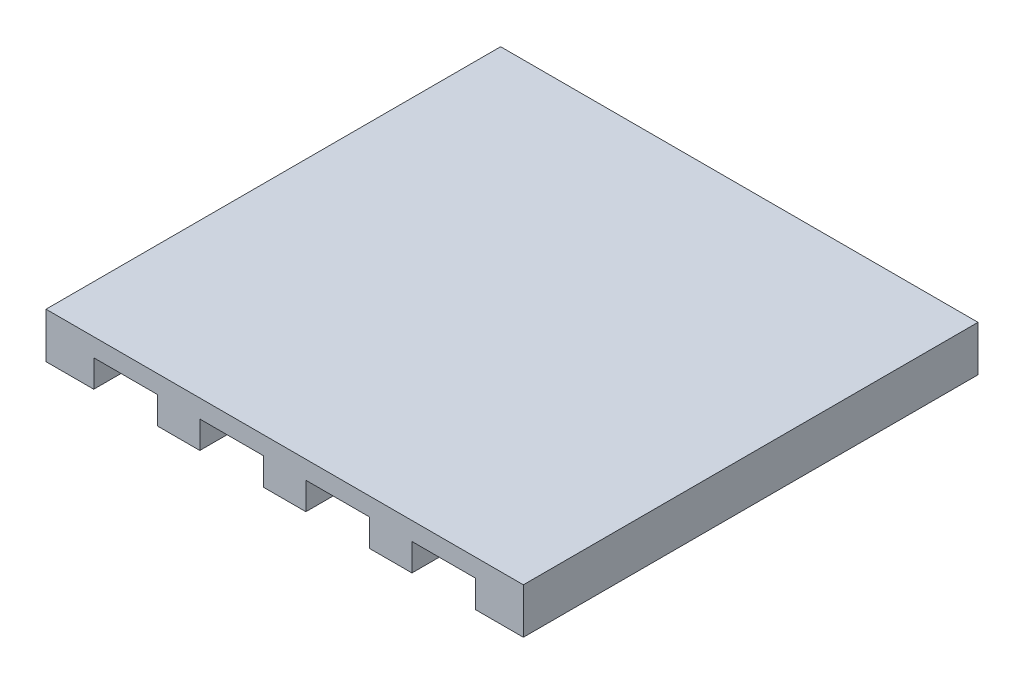
ISO-10303-21;
HEADER;
FILE_DESCRIPTION(('STEP AP214'),'2;1');
FILE_NAME('part.step','',(''),(''),'','','');
FILE_SCHEMA(('AUTOMOTIVE_DESIGN { 1 0 10303 214 1 1 1 1 }'));
ENDSEC;
DATA;
#1=APPLICATION_CONTEXT('core data for automotive mechanical design processes');
#2=APPLICATION_PROTOCOL_DEFINITION('international standard','automotive_design',2000,#1);
#3=PRODUCT_CONTEXT('',#1,'mechanical');
#4=PRODUCT('Part','Part','',(#3));
#5=PRODUCT_RELATED_PRODUCT_CATEGORY('part','',(#4));
#6=PRODUCT_DEFINITION_FORMATION('','',#4);
#7=PRODUCT_DEFINITION_CONTEXT('part definition',#1,'design');
#8=PRODUCT_DEFINITION('design','',#6,#7);
#9=PRODUCT_DEFINITION_SHAPE('','',#8);
#10=(LENGTH_UNIT() NAMED_UNIT(*) SI_UNIT(.MILLI.,.METRE.));
#11=(NAMED_UNIT(*) PLANE_ANGLE_UNIT() SI_UNIT($,.RADIAN.));
#12=(NAMED_UNIT(*) SI_UNIT($,.STERADIAN.) SOLID_ANGLE_UNIT());
#13=UNCERTAINTY_MEASURE_WITH_UNIT(LENGTH_MEASURE(1.E-05),#10,'distance_accuracy_value','');
#14=(GEOMETRIC_REPRESENTATION_CONTEXT(3) GLOBAL_UNCERTAINTY_ASSIGNED_CONTEXT((#13)) GLOBAL_UNIT_ASSIGNED_CONTEXT((#10,
#11,#12)) REPRESENTATION_CONTEXT('',''));
#15=CARTESIAN_POINT('',(0.,0.,0.));
#16=DIRECTION('',(0.,0.,1.));
#17=DIRECTION('',(1.,0.,0.));
#18=AXIS2_PLACEMENT_3D('',#15,#16,#17);
#19=CARTESIAN_POINT('',(52.5,10.,50.));
#20=DIRECTION('',(-1.,0.,0.));
#21=DIRECTION('',(0.,0.,1.));
#22=AXIS2_PLACEMENT_3D('',#19,#20,#21);
#23=PLANE('',#22);
#24=DIRECTION('',(0.,0.,-1.));
#25=VECTOR('',#24,1.);
#26=CARTESIAN_POINT('',(52.5,0.,50.));
#27=LINE('',#26,#25);
#28=CARTESIAN_POINT('',(52.5,0.,50.));
#29=VERTEX_POINT('',#28);
#30=CARTESIAN_POINT('',(52.5,0.,-50.));
#31=VERTEX_POINT('',#30);
#32=EDGE_CURVE('E347',#29,#31,#27,.T.);
#33=ORIENTED_EDGE('',*,*,#32,.T.);
#34=DIRECTION('',(0.,-1.,0.));
#35=VECTOR('',#34,1.);
#36=CARTESIAN_POINT('',(52.5,10.,-50.));
#37=LINE('',#36,#35);
#38=CARTESIAN_POINT('',(52.5,10.,-50.));
#39=VERTEX_POINT('',#38);
#40=EDGE_CURVE('E11',#39,#31,#37,.T.);
#41=ORIENTED_EDGE('',*,*,#40,.F.);
#42=DIRECTION('',(0.,0.,-1.));
#43=VECTOR('',#42,1.);
#44=CARTESIAN_POINT('',(52.5,10.,50.));
#45=LINE('',#44,#43);
#46=CARTESIAN_POINT('',(52.5,10.,50.));
#47=VERTEX_POINT('',#46);
#48=EDGE_CURVE('E332',#47,#39,#45,.T.);
#49=ORIENTED_EDGE('',*,*,#48,.F.);
#50=DIRECTION('',(0.,-1.,0.));
#51=VECTOR('',#50,1.);
#52=CARTESIAN_POINT('',(52.5,10.,50.));
#53=LINE('',#52,#51);
#54=EDGE_CURVE('E346',#47,#29,#53,.T.);
#55=ORIENTED_EDGE('',*,*,#54,.T.);
#56=EDGE_LOOP('',(#33,#41,#49,#55));
#57=FACE_BOUND('',#56,.T.);
#58=ADVANCED_FACE('F45',(#57),#23,.F.);
#59=CARTESIAN_POINT('',(-52.5,10.,-50.));
#60=DIRECTION('',(0.,0.,1.));
#61=DIRECTION('',(1.,0.,0.));
#62=AXIS2_PLACEMENT_3D('',#59,#60,#61);
#63=PLANE('',#62);
#64=DIRECTION('',(-1.,0.,0.));
#65=VECTOR('',#64,1.);
#66=CARTESIAN_POINT('',(-52.5,0.,-50.));
#67=LINE('',#66,#65);
#68=CARTESIAN_POINT('',(-52.5,0.,-50.));
#69=VERTEX_POINT('',#68);
#70=EDGE_CURVE('E351',#31,#69,#67,.T.);
#71=ORIENTED_EDGE('',*,*,#70,.T.);
#72=DIRECTION('',(0.,-1.,0.));
#73=VECTOR('',#72,1.);
#74=CARTESIAN_POINT('',(-52.5,10.,-50.));
#75=LINE('',#74,#73);
#76=CARTESIAN_POINT('',(-52.5,10.,-50.));
#77=VERTEX_POINT('',#76);
#78=EDGE_CURVE('E53',#77,#69,#75,.T.);
#79=ORIENTED_EDGE('',*,*,#78,.F.);
#80=DIRECTION('',(-1.,0.,0.));
#81=VECTOR('',#80,1.);
#82=CARTESIAN_POINT('',(-52.5,10.,-50.));
#83=LINE('',#82,#81);
#84=EDGE_CURVE('E336',#39,#77,#83,.T.);
#85=ORIENTED_EDGE('',*,*,#84,.F.);
#86=ORIENTED_EDGE('',*,*,#40,.T.);
#87=EDGE_LOOP('',(#71,#79,#85,#86));
#88=FACE_BOUND('',#87,.T.);
#89=ADVANCED_FACE('F388',(#88),#63,.F.);
#90=CARTESIAN_POINT('',(-52.5,10.,50.));
#91=DIRECTION('',(1.,0.,0.));
#92=DIRECTION('',(0.,0.,-1.));
#93=AXIS2_PLACEMENT_3D('',#90,#91,#92);
#94=PLANE('',#93);
#95=DIRECTION('',(0.,0.,1.));
#96=VECTOR('',#95,1.);
#97=CARTESIAN_POINT('',(-52.5,0.,50.));
#98=LINE('',#97,#96);
#99=CARTESIAN_POINT('',(-52.5,0.,50.));
#100=VERTEX_POINT('',#99);
#101=EDGE_CURVE('E354',#69,#100,#98,.T.);
#102=ORIENTED_EDGE('',*,*,#101,.T.);
#103=DIRECTION('',(0.,-1.,0.));
#104=VECTOR('',#103,1.);
#105=CARTESIAN_POINT('',(-52.5,10.,50.));
#106=LINE('',#105,#104);
#107=CARTESIAN_POINT('',(-52.5,10.,50.));
#108=VERTEX_POINT('',#107);
#109=EDGE_CURVE('E364',#108,#100,#106,.T.);
#110=ORIENTED_EDGE('',*,*,#109,.F.);
#111=DIRECTION('',(0.,0.,1.));
#112=VECTOR('',#111,1.);
#113=CARTESIAN_POINT('',(-52.5,10.,50.));
#114=LINE('',#113,#112);
#115=EDGE_CURVE('E340',#77,#108,#114,.T.);
#116=ORIENTED_EDGE('',*,*,#115,.F.);
#117=ORIENTED_EDGE('',*,*,#78,.T.);
#118=EDGE_LOOP('',(#102,#110,#116,#117));
#119=FACE_BOUND('',#118,.T.);
#120=ADVANCED_FACE('F373',(#119),#94,.F.);
#121=CARTESIAN_POINT('',(-52.5,10.,50.));
#122=DIRECTION('',(0.,0.,-1.));
#123=DIRECTION('',(-1.,0.,0.));
#124=AXIS2_PLACEMENT_3D('',#121,#122,#123);
#125=PLANE('',#124);
#126=DIRECTION('',(1.,0.,0.));
#127=VECTOR('',#126,1.);
#128=CARTESIAN_POINT('',(-52.5,0.,50.));
#129=LINE('',#128,#127);
#130=CARTESIAN_POINT('',(-41.995,0.,50.));
#131=VERTEX_POINT('',#130);
#132=EDGE_CURVE('E337',#100,#131,#129,.T.);
#133=ORIENTED_EDGE('',*,*,#132,.T.);
#134=DIRECTION('',(0.,-1.,0.));
#135=VECTOR('',#134,1.);
#136=CARTESIAN_POINT('',(-41.995,0.,50.));
#137=LINE('',#136,#135);
#138=CARTESIAN_POINT('',(-41.995,6.,50.));
#139=VERTEX_POINT('',#138);
#140=EDGE_CURVE('E281',#139,#131,#137,.T.);
#141=ORIENTED_EDGE('',*,*,#140,.F.);
#142=DIRECTION('',(-1.,0.,0.));
#143=VECTOR('',#142,1.);
#144=CARTESIAN_POINT('',(-41.995,6.,50.));
#145=LINE('',#144,#143);
#146=CARTESIAN_POINT('',(-27.995,6.,50.));
#147=VERTEX_POINT('',#146);
#148=EDGE_CURVE('E412',#147,#139,#145,.T.);
#149=ORIENTED_EDGE('',*,*,#148,.F.);
#150=DIRECTION('',(0.,1.,0.));
#151=VECTOR('',#150,1.);
#152=CARTESIAN_POINT('',(-27.995,0.,50.));
#153=LINE('',#152,#151);
#154=CARTESIAN_POINT('',(-27.995,0.,50.));
#155=VERTEX_POINT('',#154);
#156=EDGE_CURVE('E410',#155,#147,#153,.T.);
#157=ORIENTED_EDGE('',*,*,#156,.F.);
#158=CARTESIAN_POINT('',(-18.665,0.,50.));
#159=VERTEX_POINT('',#158);
#160=EDGE_CURVE('E207',#155,#159,#129,.T.);
#161=ORIENTED_EDGE('',*,*,#160,.T.);
#162=DIRECTION('',(0.,-1.,0.));
#163=VECTOR('',#162,1.);
#164=CARTESIAN_POINT('',(-18.665,0.,50.));
#165=LINE('',#164,#163);
#166=CARTESIAN_POINT('',(-18.665,6.,50.));
#167=VERTEX_POINT('',#166);
#168=EDGE_CURVE('E278',#167,#159,#165,.T.);
#169=ORIENTED_EDGE('',*,*,#168,.F.);
#170=DIRECTION('',(-1.,0.,0.));
#171=VECTOR('',#170,1.);
#172=CARTESIAN_POINT('',(-18.665,6.,50.));
#173=LINE('',#172,#171);
#174=CARTESIAN_POINT('',(-4.665,6.,50.));
#175=VERTEX_POINT('',#174);
#176=EDGE_CURVE('E269',#175,#167,#173,.T.);
#177=ORIENTED_EDGE('',*,*,#176,.F.);
#178=DIRECTION('',(0.,1.,0.));
#179=VECTOR('',#178,1.);
#180=CARTESIAN_POINT('',(-4.665,0.,50.));
#181=LINE('',#180,#179);
#182=CARTESIAN_POINT('',(-4.665,0.,50.));
#183=VERTEX_POINT('',#182);
#184=EDGE_CURVE('E273',#183,#175,#181,.T.);
#185=ORIENTED_EDGE('',*,*,#184,.F.);
#186=CARTESIAN_POINT('',(4.665,0.,50.));
#187=VERTEX_POINT('',#186);
#188=EDGE_CURVE('E398',#183,#187,#129,.T.);
#189=ORIENTED_EDGE('',*,*,#188,.T.);
#190=DIRECTION('',(0.,-1.,0.));
#191=VECTOR('',#190,1.);
#192=CARTESIAN_POINT('',(4.665,0.,50.));
#193=LINE('',#192,#191);
#194=CARTESIAN_POINT('',(4.665,6.,50.));
#195=VERTEX_POINT('',#194);
#196=EDGE_CURVE('E240',#195,#187,#193,.T.);
#197=ORIENTED_EDGE('',*,*,#196,.F.);
#198=DIRECTION('',(-1.,0.,0.));
#199=VECTOR('',#198,1.);
#200=CARTESIAN_POINT('',(4.665,6.,50.));
#201=LINE('',#200,#199);
#202=CARTESIAN_POINT('',(18.665,6.,50.));
#203=VERTEX_POINT('',#202);
#204=EDGE_CURVE('E232',#203,#195,#201,.T.);
#205=ORIENTED_EDGE('',*,*,#204,.F.);
#206=DIRECTION('',(0.,1.,0.));
#207=VECTOR('',#206,1.);
#208=CARTESIAN_POINT('',(18.665,0.,50.));
#209=LINE('',#208,#207);
#210=CARTESIAN_POINT('',(18.665,0.,50.));
#211=VERTEX_POINT('',#210);
#212=EDGE_CURVE('E236',#211,#203,#209,.T.);
#213=ORIENTED_EDGE('',*,*,#212,.F.);
#214=CARTESIAN_POINT('',(27.995,0.,50.));
#215=VERTEX_POINT('',#214);
#216=EDGE_CURVE('E395',#211,#215,#129,.T.);
#217=ORIENTED_EDGE('',*,*,#216,.T.);
#218=DIRECTION('',(0.,-1.,0.));
#219=VECTOR('',#218,1.);
#220=CARTESIAN_POINT('',(27.995,0.,50.));
#221=LINE('',#220,#219);
#222=CARTESIAN_POINT('',(27.995,6.,50.));
#223=VERTEX_POINT('',#222);
#224=EDGE_CURVE('E268',#223,#215,#221,.T.);
#225=ORIENTED_EDGE('',*,*,#224,.F.);
#226=DIRECTION('',(-1.,0.,0.));
#227=VECTOR('',#226,1.);
#228=CARTESIAN_POINT('',(27.995,6.,50.));
#229=LINE('',#228,#227);
#230=CARTESIAN_POINT('',(41.995,6.,50.));
#231=VERTEX_POINT('',#230);
#232=EDGE_CURVE('E308',#231,#223,#229,.T.);
#233=ORIENTED_EDGE('',*,*,#232,.F.);
#234=DIRECTION('',(0.,1.,0.));
#235=VECTOR('',#234,1.);
#236=CARTESIAN_POINT('',(41.995,0.,50.));
#237=LINE('',#236,#235);
#238=CARTESIAN_POINT('',(41.995,0.,50.));
#239=VERTEX_POINT('',#238);
#240=EDGE_CURVE('E312',#239,#231,#237,.T.);
#241=ORIENTED_EDGE('',*,*,#240,.F.);
#242=EDGE_CURVE('E357',#239,#29,#129,.T.);
#243=ORIENTED_EDGE('',*,*,#242,.T.);
#244=ORIENTED_EDGE('',*,*,#54,.F.);
#245=DIRECTION('',(1.,0.,0.));
#246=VECTOR('',#245,1.);
#247=CARTESIAN_POINT('',(-52.5,10.,50.));
#248=LINE('',#247,#246);
#249=EDGE_CURVE('E343',#108,#47,#248,.T.);
#250=ORIENTED_EDGE('',*,*,#249,.F.);
#251=ORIENTED_EDGE('',*,*,#109,.T.);
#252=EDGE_LOOP('',(#133,#141,#149,#157,#161,#169,#177,#185,#189,#197,#205,#213,#217,#225,#233,
#241,#243,#244,#250,#251));
#253=FACE_BOUND('',#252,.T.);
#254=ADVANCED_FACE('F380',(#253),#125,.F.);
#255=CARTESIAN_POINT('',(0.,10.,0.));
#256=DIRECTION('',(0.,-1.,0.));
#257=DIRECTION('',(0.,0.,-1.));
#258=AXIS2_PLACEMENT_3D('',#255,#256,#257);
#259=PLANE('',#258);
#260=ORIENTED_EDGE('',*,*,#48,.T.);
#261=ORIENTED_EDGE('',*,*,#84,.T.);
#262=ORIENTED_EDGE('',*,*,#115,.T.);
#263=ORIENTED_EDGE('',*,*,#249,.T.);
#264=EDGE_LOOP('',(#260,#261,#262,#263));
#265=FACE_BOUND('',#264,.T.);
#266=ADVANCED_FACE('F386',(#265),#259,.F.);
#267=CARTESIAN_POINT('',(0.,0.,0.));
#268=DIRECTION('',(0.,-1.,0.));
#269=DIRECTION('',(0.,0.,-1.));
#270=AXIS2_PLACEMENT_3D('',#267,#268,#269);
#271=PLANE('',#270);
#272=DIRECTION('',(0.,0.,1.));
#273=VECTOR('',#272,1.);
#274=CARTESIAN_POINT('',(-41.995,0.,15.));
#275=LINE('',#274,#273);
#276=CARTESIAN_POINT('',(-41.995,0.,15.));
#277=VERTEX_POINT('',#276);
#278=EDGE_CURVE('E209',#277,#131,#275,.T.);
#279=ORIENTED_EDGE('',*,*,#278,.T.);
#280=ORIENTED_EDGE('',*,*,#132,.F.);
#281=ORIENTED_EDGE('',*,*,#101,.F.);
#282=ORIENTED_EDGE('',*,*,#70,.F.);
#283=ORIENTED_EDGE('',*,*,#32,.F.);
#284=ORIENTED_EDGE('',*,*,#242,.F.);
#285=DIRECTION('',(0.,0.,1.));
#286=VECTOR('',#285,1.);
#287=CARTESIAN_POINT('',(41.995,0.,15.));
#288=LINE('',#287,#286);
#289=CARTESIAN_POINT('',(41.995,0.,15.));
#290=VERTEX_POINT('',#289);
#291=EDGE_CURVE('E300',#290,#239,#288,.T.);
#292=ORIENTED_EDGE('',*,*,#291,.F.);
#293=DIRECTION('',(1.,0.,0.));
#294=VECTOR('',#293,1.);
#295=CARTESIAN_POINT('',(27.995,0.,15.));
#296=LINE('',#295,#294);
#297=CARTESIAN_POINT('',(27.995,0.,15.));
#298=VERTEX_POINT('',#297);
#299=EDGE_CURVE('E326',#298,#290,#296,.T.);
#300=ORIENTED_EDGE('',*,*,#299,.F.);
#301=DIRECTION('',(0.,0.,1.));
#302=VECTOR('',#301,1.);
#303=CARTESIAN_POINT('',(27.995,0.,15.));
#304=LINE('',#303,#302);
#305=EDGE_CURVE('E295',#298,#215,#304,.T.);
#306=ORIENTED_EDGE('',*,*,#305,.T.);
#307=ORIENTED_EDGE('',*,*,#216,.F.);
#308=DIRECTION('',(0.,0.,1.));
#309=VECTOR('',#308,1.);
#310=CARTESIAN_POINT('',(18.665,0.,15.));
#311=LINE('',#310,#309);
#312=CARTESIAN_POINT('',(18.665,0.,15.));
#313=VERTEX_POINT('',#312);
#314=EDGE_CURVE('E223',#313,#211,#311,.T.);
#315=ORIENTED_EDGE('',*,*,#314,.F.);
#316=DIRECTION('',(1.,0.,0.));
#317=VECTOR('',#316,1.);
#318=CARTESIAN_POINT('',(4.665,0.,15.));
#319=LINE('',#318,#317);
#320=CARTESIAN_POINT('',(4.665,0.,15.));
#321=VERTEX_POINT('',#320);
#322=EDGE_CURVE('E250',#321,#313,#319,.T.);
#323=ORIENTED_EDGE('',*,*,#322,.F.);
#324=DIRECTION('',(0.,0.,1.));
#325=VECTOR('',#324,1.);
#326=CARTESIAN_POINT('',(4.665,0.,15.));
#327=LINE('',#326,#325);
#328=EDGE_CURVE('E218',#321,#187,#327,.T.);
#329=ORIENTED_EDGE('',*,*,#328,.T.);
#330=ORIENTED_EDGE('',*,*,#188,.F.);
#331=DIRECTION('',(0.,0.,1.));
#332=VECTOR('',#331,1.);
#333=CARTESIAN_POINT('',(-4.665,0.,15.));
#334=LINE('',#333,#332);
#335=CARTESIAN_POINT('',(-4.665,0.,15.));
#336=VERTEX_POINT('',#335);
#337=EDGE_CURVE('E259',#336,#183,#334,.T.);
#338=ORIENTED_EDGE('',*,*,#337,.F.);
#339=DIRECTION('',(1.,0.,0.));
#340=VECTOR('',#339,1.);
#341=CARTESIAN_POINT('',(-18.665,0.,15.));
#342=LINE('',#341,#340);
#343=CARTESIAN_POINT('',(-18.665,0.,15.));
#344=VERTEX_POINT('',#343);
#345=EDGE_CURVE('E289',#344,#336,#342,.T.);
#346=ORIENTED_EDGE('',*,*,#345,.F.);
#347=DIRECTION('',(0.,0.,1.));
#348=VECTOR('',#347,1.);
#349=CARTESIAN_POINT('',(-18.665,0.,15.));
#350=LINE('',#349,#348);
#351=EDGE_CURVE('E255',#344,#159,#350,.T.);
#352=ORIENTED_EDGE('',*,*,#351,.T.);
#353=ORIENTED_EDGE('',*,*,#160,.F.);
#354=DIRECTION('',(0.,0.,1.));
#355=VECTOR('',#354,1.);
#356=CARTESIAN_POINT('',(-27.995,0.,15.));
#357=LINE('',#356,#355);
#358=CARTESIAN_POINT('',(-27.995,0.,15.));
#359=VERTEX_POINT('',#358);
#360=EDGE_CURVE('E189',#359,#155,#357,.T.);
#361=ORIENTED_EDGE('',*,*,#360,.F.);
#362=DIRECTION('',(1.,0.,0.));
#363=VECTOR('',#362,1.);
#364=CARTESIAN_POINT('',(-41.995,0.,15.));
#365=LINE('',#364,#363);
#366=EDGE_CURVE('E195',#277,#359,#365,.T.);
#367=ORIENTED_EDGE('',*,*,#366,.F.);
#368=EDGE_LOOP('',(#279,#280,#281,#282,#283,#284,#292,#300,#306,#307,#315,#323,#329,#330,#338,
#346,#352,#353,#361,#367));
#369=FACE_BOUND('',#368,.T.);
#370=ADVANCED_FACE('F204',(#369),#271,.T.);
#371=CARTESIAN_POINT('',(-18.665,0.,15.));
#372=DIRECTION('',(-1.,0.,0.));
#373=DIRECTION('',(0.,0.,1.));
#374=AXIS2_PLACEMENT_3D('',#371,#372,#373);
#375=PLANE('',#374);
#376=ORIENTED_EDGE('',*,*,#168,.T.);
#377=ORIENTED_EDGE('',*,*,#351,.F.);
#378=DIRECTION('',(0.,-1.,0.));
#379=VECTOR('',#378,1.);
#380=CARTESIAN_POINT('',(-18.665,0.,15.));
#381=LINE('',#380,#379);
#382=CARTESIAN_POINT('',(-18.665,6.,15.));
#383=VERTEX_POINT('',#382);
#384=EDGE_CURVE('E274',#383,#344,#381,.T.);
#385=ORIENTED_EDGE('',*,*,#384,.F.);
#386=DIRECTION('',(0.,0.,1.));
#387=VECTOR('',#386,1.);
#388=CARTESIAN_POINT('',(-18.665,6.,15.));
#389=LINE('',#388,#387);
#390=EDGE_CURVE('E265',#383,#167,#389,.T.);
#391=ORIENTED_EDGE('',*,*,#390,.T.);
#392=EDGE_LOOP('',(#376,#377,#385,#391));
#393=FACE_BOUND('',#392,.T.);
#394=ADVANCED_FACE('F451',(#393),#375,.F.);
#395=CARTESIAN_POINT('',(-18.665,6.,15.));
#396=DIRECTION('',(0.,1.,0.));
#397=DIRECTION('',(0.,0.,1.));
#398=AXIS2_PLACEMENT_3D('',#395,#396,#397);
#399=PLANE('',#398);
#400=ORIENTED_EDGE('',*,*,#176,.T.);
#401=ORIENTED_EDGE('',*,*,#390,.F.);
#402=DIRECTION('',(-1.,0.,0.));
#403=VECTOR('',#402,1.);
#404=CARTESIAN_POINT('',(-18.665,6.,15.));
#405=LINE('',#404,#403);
#406=CARTESIAN_POINT('',(-4.665,6.,15.));
#407=VERTEX_POINT('',#406);
#408=EDGE_CURVE('E258',#407,#383,#405,.T.);
#409=ORIENTED_EDGE('',*,*,#408,.F.);
#410=DIRECTION('',(0.,0.,1.));
#411=VECTOR('',#410,1.);
#412=CARTESIAN_POINT('',(-4.665,6.,15.));
#413=LINE('',#412,#411);
#414=EDGE_CURVE('E262',#407,#175,#413,.T.);
#415=ORIENTED_EDGE('',*,*,#414,.T.);
#416=EDGE_LOOP('',(#400,#401,#409,#415));
#417=FACE_BOUND('',#416,.T.);
#418=ADVANCED_FACE('F476',(#417),#399,.F.);
#419=CARTESIAN_POINT('',(-4.665,0.,15.));
#420=DIRECTION('',(1.,0.,0.));
#421=DIRECTION('',(0.,0.,-1.));
#422=AXIS2_PLACEMENT_3D('',#419,#420,#421);
#423=PLANE('',#422);
#424=ORIENTED_EDGE('',*,*,#184,.T.);
#425=ORIENTED_EDGE('',*,*,#414,.F.);
#426=DIRECTION('',(0.,1.,0.));
#427=VECTOR('',#426,1.);
#428=CARTESIAN_POINT('',(-4.665,0.,15.));
#429=LINE('',#428,#427);
#430=EDGE_CURVE('E285',#336,#407,#429,.T.);
#431=ORIENTED_EDGE('',*,*,#430,.F.);
#432=ORIENTED_EDGE('',*,*,#337,.T.);
#433=EDGE_LOOP('',(#424,#425,#431,#432));
#434=FACE_BOUND('',#433,.T.);
#435=ADVANCED_FACE('F474',(#434),#423,.F.);
#436=CARTESIAN_POINT('',(0.,0.,15.));
#437=DIRECTION('',(0.,0.,-1.));
#438=DIRECTION('',(-1.,0.,0.));
#439=AXIS2_PLACEMENT_3D('',#436,#437,#438);
#440=PLANE('',#439);
#441=ORIENTED_EDGE('',*,*,#384,.T.);
#442=ORIENTED_EDGE('',*,*,#345,.T.);
#443=ORIENTED_EDGE('',*,*,#430,.T.);
#444=ORIENTED_EDGE('',*,*,#408,.T.);
#445=EDGE_LOOP('',(#441,#442,#443,#444));
#446=FACE_BOUND('',#445,.T.);
#447=ADVANCED_FACE('F470',(#446),#440,.F.);
#448=CARTESIAN_POINT('',(27.995,0.,15.));
#449=DIRECTION('',(-1.,0.,0.));
#450=DIRECTION('',(0.,0.,1.));
#451=AXIS2_PLACEMENT_3D('',#448,#449,#450);
#452=PLANE('',#451);
#453=ORIENTED_EDGE('',*,*,#224,.T.);
#454=ORIENTED_EDGE('',*,*,#305,.F.);
#455=DIRECTION('',(0.,-1.,0.));
#456=VECTOR('',#455,1.);
#457=CARTESIAN_POINT('',(27.995,0.,15.));
#458=LINE('',#457,#456);
#459=CARTESIAN_POINT('',(27.995,6.,15.));
#460=VERTEX_POINT('',#459);
#461=EDGE_CURVE('E313',#460,#298,#458,.T.);
#462=ORIENTED_EDGE('',*,*,#461,.F.);
#463=DIRECTION('',(0.,0.,1.));
#464=VECTOR('',#463,1.);
#465=CARTESIAN_POINT('',(27.995,6.,15.));
#466=LINE('',#465,#464);
#467=EDGE_CURVE('E243',#460,#223,#466,.T.);
#468=ORIENTED_EDGE('',*,*,#467,.T.);
#469=EDGE_LOOP('',(#453,#454,#462,#468));
#470=FACE_BOUND('',#469,.T.);
#471=ADVANCED_FACE('F463',(#470),#452,.F.);
#472=CARTESIAN_POINT('',(27.995,6.,15.));
#473=DIRECTION('',(0.,1.,0.));
#474=DIRECTION('',(0.,0.,1.));
#475=AXIS2_PLACEMENT_3D('',#472,#473,#474);
#476=PLANE('',#475);
#477=ORIENTED_EDGE('',*,*,#232,.T.);
#478=ORIENTED_EDGE('',*,*,#467,.F.);
#479=DIRECTION('',(-1.,0.,0.));
#480=VECTOR('',#479,1.);
#481=CARTESIAN_POINT('',(27.995,6.,15.));
#482=LINE('',#481,#480);
#483=CARTESIAN_POINT('',(41.995,6.,15.));
#484=VERTEX_POINT('',#483);
#485=EDGE_CURVE('E299',#484,#460,#482,.T.);
#486=ORIENTED_EDGE('',*,*,#485,.F.);
#487=DIRECTION('',(0.,0.,1.));
#488=VECTOR('',#487,1.);
#489=CARTESIAN_POINT('',(41.995,6.,15.));
#490=LINE('',#489,#488);
#491=EDGE_CURVE('E303',#484,#231,#490,.T.);
#492=ORIENTED_EDGE('',*,*,#491,.T.);
#493=EDGE_LOOP('',(#477,#478,#486,#492));
#494=FACE_BOUND('',#493,.T.);
#495=ADVANCED_FACE('F460',(#494),#476,.F.);
#496=CARTESIAN_POINT('',(41.995,0.,15.));
#497=DIRECTION('',(1.,0.,0.));
#498=DIRECTION('',(0.,0.,-1.));
#499=AXIS2_PLACEMENT_3D('',#496,#497,#498);
#500=PLANE('',#499);
#501=ORIENTED_EDGE('',*,*,#240,.T.);
#502=ORIENTED_EDGE('',*,*,#491,.F.);
#503=DIRECTION('',(0.,1.,0.));
#504=VECTOR('',#503,1.);
#505=CARTESIAN_POINT('',(41.995,0.,15.));
#506=LINE('',#505,#504);
#507=EDGE_CURVE('E322',#290,#484,#506,.T.);
#508=ORIENTED_EDGE('',*,*,#507,.F.);
#509=ORIENTED_EDGE('',*,*,#291,.T.);
#510=EDGE_LOOP('',(#501,#502,#508,#509));
#511=FACE_BOUND('',#510,.T.);
#512=ADVANCED_FACE('F458',(#511),#500,.F.);
#513=CARTESIAN_POINT('',(0.,0.,15.));
#514=DIRECTION('',(0.,0.,-1.));
#515=DIRECTION('',(-1.,0.,0.));
#516=AXIS2_PLACEMENT_3D('',#513,#514,#515);
#517=PLANE('',#516);
#518=ORIENTED_EDGE('',*,*,#461,.T.);
#519=ORIENTED_EDGE('',*,*,#299,.T.);
#520=ORIENTED_EDGE('',*,*,#507,.T.);
#521=ORIENTED_EDGE('',*,*,#485,.T.);
#522=EDGE_LOOP('',(#518,#519,#520,#521));
#523=FACE_BOUND('',#522,.T.);
#524=ADVANCED_FACE('F454',(#523),#517,.F.);
#525=CARTESIAN_POINT('',(4.665,0.,15.));
#526=DIRECTION('',(-1.,0.,0.));
#527=DIRECTION('',(0.,0.,1.));
#528=AXIS2_PLACEMENT_3D('',#525,#526,#527);
#529=PLANE('',#528);
#530=ORIENTED_EDGE('',*,*,#196,.T.);
#531=ORIENTED_EDGE('',*,*,#328,.F.);
#532=DIRECTION('',(0.,-1.,0.));
#533=VECTOR('',#532,1.);
#534=CARTESIAN_POINT('',(4.665,0.,15.));
#535=LINE('',#534,#533);
#536=CARTESIAN_POINT('',(4.665,6.,15.));
#537=VERTEX_POINT('',#536);
#538=EDGE_CURVE('E68',#537,#321,#535,.T.);
#539=ORIENTED_EDGE('',*,*,#538,.F.);
#540=DIRECTION('',(0.,0.,1.));
#541=VECTOR('',#540,1.);
#542=CARTESIAN_POINT('',(4.665,6.,15.));
#543=LINE('',#542,#541);
#544=EDGE_CURVE('E229',#537,#195,#543,.T.);
#545=ORIENTED_EDGE('',*,*,#544,.T.);
#546=EDGE_LOOP('',(#530,#531,#539,#545));
#547=FACE_BOUND('',#546,.T.);
#548=ADVANCED_FACE('F457',(#547),#529,.F.);
#549=CARTESIAN_POINT('',(4.665,6.,15.));
#550=DIRECTION('',(0.,1.,0.));
#551=DIRECTION('',(0.,0.,1.));
#552=AXIS2_PLACEMENT_3D('',#549,#550,#551);
#553=PLANE('',#552);
#554=ORIENTED_EDGE('',*,*,#204,.T.);
#555=ORIENTED_EDGE('',*,*,#544,.F.);
#556=DIRECTION('',(-1.,0.,0.));
#557=VECTOR('',#556,1.);
#558=CARTESIAN_POINT('',(4.665,6.,15.));
#559=LINE('',#558,#557);
#560=CARTESIAN_POINT('',(18.665,6.,15.));
#561=VERTEX_POINT('',#560);
#562=EDGE_CURVE('E222',#561,#537,#559,.T.);
#563=ORIENTED_EDGE('',*,*,#562,.F.);
#564=DIRECTION('',(0.,0.,1.));
#565=VECTOR('',#564,1.);
#566=CARTESIAN_POINT('',(18.665,6.,15.));
#567=LINE('',#566,#565);
#568=EDGE_CURVE('E226',#561,#203,#567,.T.);
#569=ORIENTED_EDGE('',*,*,#568,.T.);
#570=EDGE_LOOP('',(#554,#555,#563,#569));
#571=FACE_BOUND('',#570,.T.);
#572=ADVANCED_FACE('F489',(#571),#553,.F.);
#573=CARTESIAN_POINT('',(18.665,0.,15.));
#574=DIRECTION('',(1.,0.,0.));
#575=DIRECTION('',(0.,0.,-1.));
#576=AXIS2_PLACEMENT_3D('',#573,#574,#575);
#577=PLANE('',#576);
#578=ORIENTED_EDGE('',*,*,#212,.T.);
#579=ORIENTED_EDGE('',*,*,#568,.F.);
#580=DIRECTION('',(0.,1.,0.));
#581=VECTOR('',#580,1.);
#582=CARTESIAN_POINT('',(18.665,0.,15.));
#583=LINE('',#582,#581);
#584=EDGE_CURVE('E246',#313,#561,#583,.T.);
#585=ORIENTED_EDGE('',*,*,#584,.F.);
#586=ORIENTED_EDGE('',*,*,#314,.T.);
#587=EDGE_LOOP('',(#578,#579,#585,#586));
#588=FACE_BOUND('',#587,.T.);
#589=ADVANCED_FACE('F488',(#588),#577,.F.);
#590=CARTESIAN_POINT('',(0.,0.,15.));
#591=DIRECTION('',(0.,0.,-1.));
#592=DIRECTION('',(-1.,0.,0.));
#593=AXIS2_PLACEMENT_3D('',#590,#591,#592);
#594=PLANE('',#593);
#595=ORIENTED_EDGE('',*,*,#538,.T.);
#596=ORIENTED_EDGE('',*,*,#322,.T.);
#597=ORIENTED_EDGE('',*,*,#584,.T.);
#598=ORIENTED_EDGE('',*,*,#562,.T.);
#599=EDGE_LOOP('',(#595,#596,#597,#598));
#600=FACE_BOUND('',#599,.T.);
#601=ADVANCED_FACE('F435',(#600),#594,.F.);
#602=CARTESIAN_POINT('',(-41.995,0.,15.));
#603=DIRECTION('',(-1.,0.,0.));
#604=DIRECTION('',(0.,0.,1.));
#605=AXIS2_PLACEMENT_3D('',#602,#603,#604);
#606=PLANE('',#605);
#607=ORIENTED_EDGE('',*,*,#140,.T.);
#608=ORIENTED_EDGE('',*,*,#278,.F.);
#609=DIRECTION('',(0.,-1.,0.));
#610=VECTOR('',#609,1.);
#611=CARTESIAN_POINT('',(-41.995,0.,15.));
#612=LINE('',#611,#610);
#613=CARTESIAN_POINT('',(-41.995,6.,15.));
#614=VERTEX_POINT('',#613);
#615=EDGE_CURVE('E60',#614,#277,#612,.T.);
#616=ORIENTED_EDGE('',*,*,#615,.F.);
#617=DIRECTION('',(0.,0.,1.));
#618=VECTOR('',#617,1.);
#619=CARTESIAN_POINT('',(-41.995,6.,15.));
#620=LINE('',#619,#618);
#621=EDGE_CURVE('E213',#614,#139,#620,.T.);
#622=ORIENTED_EDGE('',*,*,#621,.T.);
#623=EDGE_LOOP('',(#607,#608,#616,#622));
#624=FACE_BOUND('',#623,.T.);
#625=ADVANCED_FACE('F422',(#624),#606,.F.);
#626=CARTESIAN_POINT('',(-41.995,6.,15.));
#627=DIRECTION('',(0.,1.,0.));
#628=DIRECTION('',(-1.,0.,0.));
#629=AXIS2_PLACEMENT_3D('',#626,#627,#628);
#630=PLANE('',#629);
#631=ORIENTED_EDGE('',*,*,#148,.T.);
#632=ORIENTED_EDGE('',*,*,#621,.F.);
#633=DIRECTION('',(-1.,0.,0.));
#634=VECTOR('',#633,1.);
#635=CARTESIAN_POINT('',(-41.995,6.,15.));
#636=LINE('',#635,#634);
#637=CARTESIAN_POINT('',(-27.995,6.,15.));
#638=VERTEX_POINT('',#637);
#639=EDGE_CURVE('E194',#638,#614,#636,.T.);
#640=ORIENTED_EDGE('',*,*,#639,.F.);
#641=DIRECTION('',(0.,0.,1.));
#642=VECTOR('',#641,1.);
#643=CARTESIAN_POINT('',(-27.995,6.,15.));
#644=LINE('',#643,#642);
#645=EDGE_CURVE('E191',#638,#147,#644,.T.);
#646=ORIENTED_EDGE('',*,*,#645,.T.);
#647=EDGE_LOOP('',(#631,#632,#640,#646));
#648=FACE_BOUND('',#647,.T.);
#649=ADVANCED_FACE('F424',(#648),#630,.F.);
#650=CARTESIAN_POINT('',(-27.995,0.,15.));
#651=DIRECTION('',(1.,0.,0.));
#652=DIRECTION('',(0.,0.,-1.));
#653=AXIS2_PLACEMENT_3D('',#650,#651,#652);
#654=PLANE('',#653);
#655=ORIENTED_EDGE('',*,*,#156,.T.);
#656=ORIENTED_EDGE('',*,*,#645,.F.);
#657=DIRECTION('',(0.,1.,0.));
#658=VECTOR('',#657,1.);
#659=CARTESIAN_POINT('',(-27.995,0.,15.));
#660=LINE('',#659,#658);
#661=EDGE_CURVE('E185',#359,#638,#660,.T.);
#662=ORIENTED_EDGE('',*,*,#661,.F.);
#663=ORIENTED_EDGE('',*,*,#360,.T.);
#664=EDGE_LOOP('',(#655,#656,#662,#663));
#665=FACE_BOUND('',#664,.T.);
#666=ADVANCED_FACE('F187',(#665),#654,.F.);
#667=CARTESIAN_POINT('',(0.,0.,15.));
#668=DIRECTION('',(0.,0.,-1.));
#669=DIRECTION('',(-1.,0.,0.));
#670=AXIS2_PLACEMENT_3D('',#667,#668,#669);
#671=PLANE('',#670);
#672=ORIENTED_EDGE('',*,*,#615,.T.);
#673=ORIENTED_EDGE('',*,*,#366,.T.);
#674=ORIENTED_EDGE('',*,*,#661,.T.);
#675=ORIENTED_EDGE('',*,*,#639,.T.);
#676=EDGE_LOOP('',(#672,#673,#674,#675));
#677=FACE_BOUND('',#676,.T.);
#678=ADVANCED_FACE('F198',(#677),#671,.F.);
#679=CLOSED_SHELL('',(#58,#89,#120,#254,#266,#370,#394,#418,#435,#447,#471,#495,#512,#524,#548,
#572,#589,#601,#625,#649,#666,#678));
#680=MANIFOLD_SOLID_BREP('B2',#679);
#681=ADVANCED_BREP_SHAPE_REPRESENTATION('',(#18,#680),#14);
#682=SHAPE_DEFINITION_REPRESENTATION(#9,#681);
ENDSEC;
END-ISO-10303-21;
